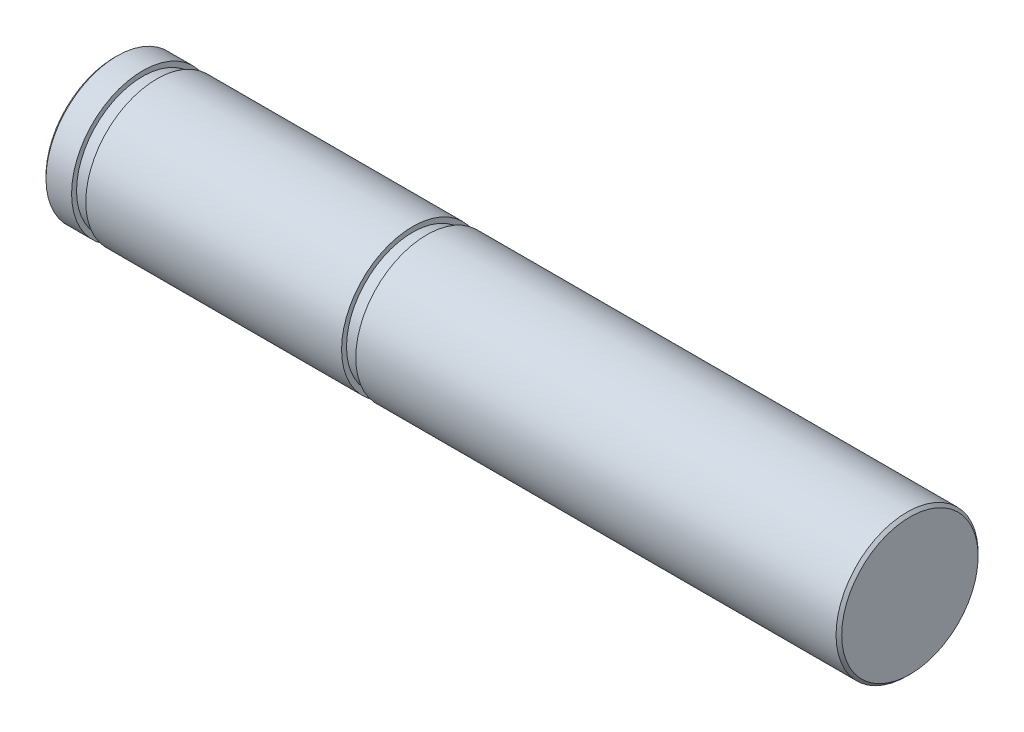
ISO-10303-21;
HEADER;
FILE_DESCRIPTION(('STEP AP214'),'2;1');
FILE_NAME('part.step','',(''),(''),'','','');
FILE_SCHEMA(('AUTOMOTIVE_DESIGN { 1 0 10303 214 1 1 1 1 }'));
ENDSEC;
DATA;
#1=APPLICATION_CONTEXT('core data for automotive mechanical design processes');
#2=APPLICATION_PROTOCOL_DEFINITION('international standard','automotive_design',2000,#1);
#3=PRODUCT_CONTEXT('',#1,'mechanical');
#4=PRODUCT('Part','Part','',(#3));
#5=PRODUCT_RELATED_PRODUCT_CATEGORY('part','',(#4));
#6=PRODUCT_DEFINITION_FORMATION('','',#4);
#7=PRODUCT_DEFINITION_CONTEXT('part definition',#1,'design');
#8=PRODUCT_DEFINITION('design','',#6,#7);
#9=PRODUCT_DEFINITION_SHAPE('','',#8);
#10=(LENGTH_UNIT() NAMED_UNIT(*) SI_UNIT(.MILLI.,.METRE.));
#11=(NAMED_UNIT(*) PLANE_ANGLE_UNIT() SI_UNIT($,.RADIAN.));
#12=(NAMED_UNIT(*) SI_UNIT($,.STERADIAN.) SOLID_ANGLE_UNIT());
#13=UNCERTAINTY_MEASURE_WITH_UNIT(LENGTH_MEASURE(1.E-05),#10,'distance_accuracy_value','');
#14=(GEOMETRIC_REPRESENTATION_CONTEXT(3) GLOBAL_UNCERTAINTY_ASSIGNED_CONTEXT((#13)) GLOBAL_UNIT_ASSIGNED_CONTEXT((#10,
#11,#12)) REPRESENTATION_CONTEXT('',''));
#15=CARTESIAN_POINT('',(0.,0.,0.));
#16=DIRECTION('',(0.,0.,1.));
#17=DIRECTION('',(1.,0.,0.));
#18=AXIS2_PLACEMENT_3D('',#15,#16,#17);
#19=CARTESIAN_POINT('',(0.,0.,0.));
#20=DIRECTION('',(-1.,0.,0.));
#21=DIRECTION('',(0.,0.,1.));
#22=AXIS2_PLACEMENT_3D('',#19,#20,#21);
#23=PLANE('',#22);
#24=CARTESIAN_POINT('',(0.,0.,0.));
#25=DIRECTION('',(-1.,0.,0.));
#26=DIRECTION('',(0.,0.,1.));
#27=AXIS2_PLACEMENT_3D('',#24,#25,#26);
#28=CIRCLE('',#27,4.80000000000001);
#29=CARTESIAN_POINT('',(0.,0.,4.80000000000001));
#30=VERTEX_POINT('',#29);
#31=EDGE_CURVE('E48',#30,#30,#28,.F.);
#32=ORIENTED_EDGE('',*,*,#31,.T.);
#33=EDGE_LOOP('',(#32));
#34=FACE_BOUND('',#33,.T.);
#35=ADVANCED_FACE('F36',(#34),#23,.F.);
#36=CARTESIAN_POINT('',(0.,0.,0.));
#37=DIRECTION('',(-1.,0.,0.));
#38=DIRECTION('',(0.,0.,1.));
#39=AXIS2_PLACEMENT_3D('',#36,#37,#38);
#40=CYLINDRICAL_SURFACE('',#39,5.);
#41=CARTESIAN_POINT('',(-0.200000000000002,0.,0.));
#42=DIRECTION('',(-1.,0.,0.));
#43=DIRECTION('',(0.,0.,1.));
#44=AXIS2_PLACEMENT_3D('',#41,#42,#43);
#45=CIRCLE('',#44,5.);
#46=CARTESIAN_POINT('',(-0.200000000000002,0.,5.));
#47=VERTEX_POINT('',#46);
#48=EDGE_CURVE('E52',#47,#47,#45,.T.);
#49=ORIENTED_EDGE('',*,*,#48,.T.);
#50=EDGE_LOOP('',(#49));
#51=FACE_BOUND('',#50,.T.);
#52=CARTESIAN_POINT('',(-34.,0.,0.));
#53=DIRECTION('',(-1.,0.,0.));
#54=DIRECTION('',(0.,0.,1.));
#55=AXIS2_PLACEMENT_3D('',#52,#53,#54);
#56=CIRCLE('',#55,5.);
#57=CARTESIAN_POINT('',(-34.,0.,5.));
#58=VERTEX_POINT('',#57);
#59=EDGE_CURVE('E57',#58,#58,#56,.T.);
#60=ORIENTED_EDGE('',*,*,#59,.F.);
#61=EDGE_LOOP('',(#60));
#62=FACE_BOUND('',#61,.T.);
#63=ADVANCED_FACE('F123',(#51,#62),#40,.T.);
#64=CARTESIAN_POINT('',(-34.,4.65,0.));
#65=DIRECTION('',(1.,0.,0.));
#66=DIRECTION('',(0.,0.,-1.));
#67=AXIS2_PLACEMENT_3D('',#64,#65,#66);
#68=PLANE('',#67);
#69=CARTESIAN_POINT('',(-34.,0.,0.));
#70=DIRECTION('',(-1.,0.,0.));
#71=DIRECTION('',(0.,0.,1.));
#72=AXIS2_PLACEMENT_3D('',#69,#70,#71);
#73=CIRCLE('',#72,4.65);
#74=CARTESIAN_POINT('',(-34.,0.,4.65));
#75=VERTEX_POINT('',#74);
#76=EDGE_CURVE('E60',#75,#75,#73,.T.);
#77=ORIENTED_EDGE('',*,*,#76,.F.);
#78=EDGE_LOOP('',(#77));
#79=FACE_BOUND('',#78,.T.);
#80=ORIENTED_EDGE('',*,*,#59,.T.);
#81=EDGE_LOOP('',(#80));
#82=FACE_BOUND('',#81,.T.);
#83=ADVANCED_FACE('F117',(#79,#82),#68,.F.);
#84=CARTESIAN_POINT('',(0.,0.,0.));
#85=DIRECTION('',(-1.,0.,0.));
#86=DIRECTION('',(0.,0.,1.));
#87=AXIS2_PLACEMENT_3D('',#84,#85,#86);
#88=CYLINDRICAL_SURFACE('',#87,4.65);
#89=CARTESIAN_POINT('',(-35.,0.,0.));
#90=DIRECTION('',(-1.,0.,0.));
#91=DIRECTION('',(0.,0.,1.));
#92=AXIS2_PLACEMENT_3D('',#89,#90,#91);
#93=CIRCLE('',#92,4.65);
#94=CARTESIAN_POINT('',(-35.,0.,4.65));
#95=VERTEX_POINT('',#94);
#96=EDGE_CURVE('E63',#95,#95,#93,.T.);
#97=ORIENTED_EDGE('',*,*,#96,.F.);
#98=EDGE_LOOP('',(#97));
#99=FACE_BOUND('',#98,.T.);
#100=ORIENTED_EDGE('',*,*,#76,.T.);
#101=EDGE_LOOP('',(#100));
#102=FACE_BOUND('',#101,.T.);
#103=ADVANCED_FACE('F111',(#99,#102),#88,.T.);
#104=CARTESIAN_POINT('',(-35.,5.,0.));
#105=DIRECTION('',(-1.,0.,0.));
#106=DIRECTION('',(0.,0.,1.));
#107=AXIS2_PLACEMENT_3D('',#104,#105,#106);
#108=PLANE('',#107);
#109=CARTESIAN_POINT('',(-35.,0.,0.));
#110=DIRECTION('',(-1.,0.,0.));
#111=DIRECTION('',(0.,0.,1.));
#112=AXIS2_PLACEMENT_3D('',#109,#110,#111);
#113=CIRCLE('',#112,5.);
#114=CARTESIAN_POINT('',(-35.,0.,5.));
#115=VERTEX_POINT('',#114);
#116=EDGE_CURVE('E66',#115,#115,#113,.T.);
#117=ORIENTED_EDGE('',*,*,#116,.F.);
#118=EDGE_LOOP('',(#117));
#119=FACE_BOUND('',#118,.T.);
#120=ORIENTED_EDGE('',*,*,#96,.T.);
#121=EDGE_LOOP('',(#120));
#122=FACE_BOUND('',#121,.T.);
#123=ADVANCED_FACE('F105',(#119,#122),#108,.F.);
#124=CARTESIAN_POINT('',(0.,0.,0.));
#125=DIRECTION('',(-1.,0.,0.));
#126=DIRECTION('',(0.,0.,1.));
#127=AXIS2_PLACEMENT_3D('',#124,#125,#126);
#128=CYLINDRICAL_SURFACE('',#127,5.);
#129=CARTESIAN_POINT('',(-53.,0.,0.));
#130=DIRECTION('',(-1.,0.,0.));
#131=DIRECTION('',(0.,0.,1.));
#132=AXIS2_PLACEMENT_3D('',#129,#130,#131);
#133=CIRCLE('',#132,5.00000000000001);
#134=CARTESIAN_POINT('',(-53.,0.,5.00000000000001));
#135=VERTEX_POINT('',#134);
#136=EDGE_CURVE('E69',#135,#135,#133,.T.);
#137=ORIENTED_EDGE('',*,*,#136,.F.);
#138=EDGE_LOOP('',(#137));
#139=FACE_BOUND('',#138,.T.);
#140=ORIENTED_EDGE('',*,*,#116,.T.);
#141=EDGE_LOOP('',(#140));
#142=FACE_BOUND('',#141,.T.);
#143=ADVANCED_FACE('F99',(#139,#142),#128,.T.);
#144=CARTESIAN_POINT('',(-53.,5.00000000000001,0.));
#145=DIRECTION('',(1.,0.,0.));
#146=DIRECTION('',(0.,0.,-1.));
#147=AXIS2_PLACEMENT_3D('',#144,#145,#146);
#148=PLANE('',#147);
#149=CARTESIAN_POINT('',(-53.,0.,0.));
#150=DIRECTION('',(-1.,0.,0.));
#151=DIRECTION('',(0.,0.,1.));
#152=AXIS2_PLACEMENT_3D('',#149,#150,#151);
#153=CIRCLE('',#152,4.65);
#154=CARTESIAN_POINT('',(-53.,0.,4.65));
#155=VERTEX_POINT('',#154);
#156=EDGE_CURVE('E72',#155,#155,#153,.T.);
#157=ORIENTED_EDGE('',*,*,#156,.F.);
#158=EDGE_LOOP('',(#157));
#159=FACE_BOUND('',#158,.T.);
#160=ORIENTED_EDGE('',*,*,#136,.T.);
#161=EDGE_LOOP('',(#160));
#162=FACE_BOUND('',#161,.T.);
#163=ADVANCED_FACE('F93',(#159,#162),#148,.F.);
#164=CARTESIAN_POINT('',(0.,0.,0.));
#165=DIRECTION('',(-1.,0.,0.));
#166=DIRECTION('',(0.,0.,1.));
#167=AXIS2_PLACEMENT_3D('',#164,#165,#166);
#168=CYLINDRICAL_SURFACE('',#167,4.65);
#169=CARTESIAN_POINT('',(-54.,0.,0.));
#170=DIRECTION('',(-1.,0.,0.));
#171=DIRECTION('',(0.,0.,1.));
#172=AXIS2_PLACEMENT_3D('',#169,#170,#171);
#173=CIRCLE('',#172,4.65);
#174=CARTESIAN_POINT('',(-54.,0.,4.65));
#175=VERTEX_POINT('',#174);
#176=EDGE_CURVE('E75',#175,#175,#173,.T.);
#177=ORIENTED_EDGE('',*,*,#176,.F.);
#178=EDGE_LOOP('',(#177));
#179=FACE_BOUND('',#178,.T.);
#180=ORIENTED_EDGE('',*,*,#156,.T.);
#181=EDGE_LOOP('',(#180));
#182=FACE_BOUND('',#181,.T.);
#183=ADVANCED_FACE('F87',(#179,#182),#168,.T.);
#184=CARTESIAN_POINT('',(-54.,4.65,0.));
#185=DIRECTION('',(-1.,0.,0.));
#186=DIRECTION('',(0.,0.,1.));
#187=AXIS2_PLACEMENT_3D('',#184,#185,#186);
#188=PLANE('',#187);
#189=CARTESIAN_POINT('',(-54.,0.,0.));
#190=DIRECTION('',(-1.,0.,0.));
#191=DIRECTION('',(0.,0.,1.));
#192=AXIS2_PLACEMENT_3D('',#189,#190,#191);
#193=CIRCLE('',#192,5.00000000000001);
#194=CARTESIAN_POINT('',(-54.,0.,5.00000000000001));
#195=VERTEX_POINT('',#194);
#196=EDGE_CURVE('E78',#195,#195,#193,.T.);
#197=ORIENTED_EDGE('',*,*,#196,.F.);
#198=EDGE_LOOP('',(#197));
#199=FACE_BOUND('',#198,.T.);
#200=ORIENTED_EDGE('',*,*,#176,.T.);
#201=EDGE_LOOP('',(#200));
#202=FACE_BOUND('',#201,.T.);
#203=ADVANCED_FACE('F84',(#199,#202),#188,.F.);
#204=CARTESIAN_POINT('',(0.,0.,0.));
#205=DIRECTION('',(-1.,0.,0.));
#206=DIRECTION('',(0.,0.,1.));
#207=AXIS2_PLACEMENT_3D('',#204,#205,#206);
#208=CYLINDRICAL_SURFACE('',#207,5.00000000000001);
#209=CARTESIAN_POINT('',(-55.8,0.,0.));
#210=DIRECTION('',(1.,0.,0.));
#211=DIRECTION('',(0.,0.,-1.));
#212=AXIS2_PLACEMENT_3D('',#209,#210,#211);
#213=CIRCLE('',#212,5.00000000000001);
#214=CARTESIAN_POINT('',(-55.8,0.,-5.00000000000001));
#215=VERTEX_POINT('',#214);
#216=EDGE_CURVE('E10',#215,#215,#213,.T.);
#217=ORIENTED_EDGE('',*,*,#216,.T.);
#218=EDGE_LOOP('',(#217));
#219=FACE_BOUND('',#218,.T.);
#220=ORIENTED_EDGE('',*,*,#196,.T.);
#221=EDGE_LOOP('',(#220));
#222=FACE_BOUND('',#221,.T.);
#223=ADVANCED_FACE('F82',(#219,#222),#208,.T.);
#224=CARTESIAN_POINT('',(-56.,5.00000000000001,0.));
#225=DIRECTION('',(1.,0.,0.));
#226=DIRECTION('',(0.,0.,-1.));
#227=AXIS2_PLACEMENT_3D('',#224,#225,#226);
#228=PLANE('',#227);
#229=CARTESIAN_POINT('',(-56.,0.,0.));
#230=DIRECTION('',(1.,0.,0.));
#231=DIRECTION('',(0.,0.,-1.));
#232=AXIS2_PLACEMENT_3D('',#229,#230,#231);
#233=CIRCLE('',#232,4.8);
#234=CARTESIAN_POINT('',(-56.,0.,-4.8));
#235=VERTEX_POINT('',#234);
#236=EDGE_CURVE('E44',#235,#235,#233,.F.);
#237=ORIENTED_EDGE('',*,*,#236,.T.);
#238=EDGE_LOOP('',(#237));
#239=FACE_BOUND('',#238,.T.);
#240=ADVANCED_FACE('F140',(#239),#228,.F.);
#241=CARTESIAN_POINT('',(-0.200000000000002,0.,0.));
#242=DIRECTION('',(-1.,0.,0.));
#243=DIRECTION('',(0.,0.,1.));
#244=AXIS2_PLACEMENT_3D('',#241,#242,#243);
#245=CONICAL_SURFACE('',#244,5.,0.785398163397433);
#246=ORIENTED_EDGE('',*,*,#31,.F.);
#247=EDGE_LOOP('',(#246));
#248=FACE_BOUND('',#247,.T.);
#249=ORIENTED_EDGE('',*,*,#48,.F.);
#250=EDGE_LOOP('',(#249));
#251=FACE_BOUND('',#250,.T.);
#252=ADVANCED_FACE('F136',(#248,#251),#245,.T.);
#253=CARTESIAN_POINT('',(-56.,0.,0.));
#254=DIRECTION('',(1.,0.,0.));
#255=DIRECTION('',(0.,0.,-1.));
#256=AXIS2_PLACEMENT_3D('',#253,#254,#255);
#257=CONICAL_SURFACE('',#256,4.8,0.785398163397453);
#258=ORIENTED_EDGE('',*,*,#216,.F.);
#259=EDGE_LOOP('',(#258));
#260=FACE_BOUND('',#259,.T.);
#261=ORIENTED_EDGE('',*,*,#236,.F.);
#262=EDGE_LOOP('',(#261));
#263=FACE_BOUND('',#262,.T.);
#264=ADVANCED_FACE('F39',(#260,#263),#257,.T.);
#265=CLOSED_SHELL('',(#35,#63,#83,#103,#123,#143,#163,#183,#203,#223,#240,#252,#264));
#266=MANIFOLD_SOLID_BREP('B2',#265);
#267=ADVANCED_BREP_SHAPE_REPRESENTATION('',(#18,#266),#14);
#268=SHAPE_DEFINITION_REPRESENTATION(#9,#267);
ENDSEC;
END-ISO-10303-21;
